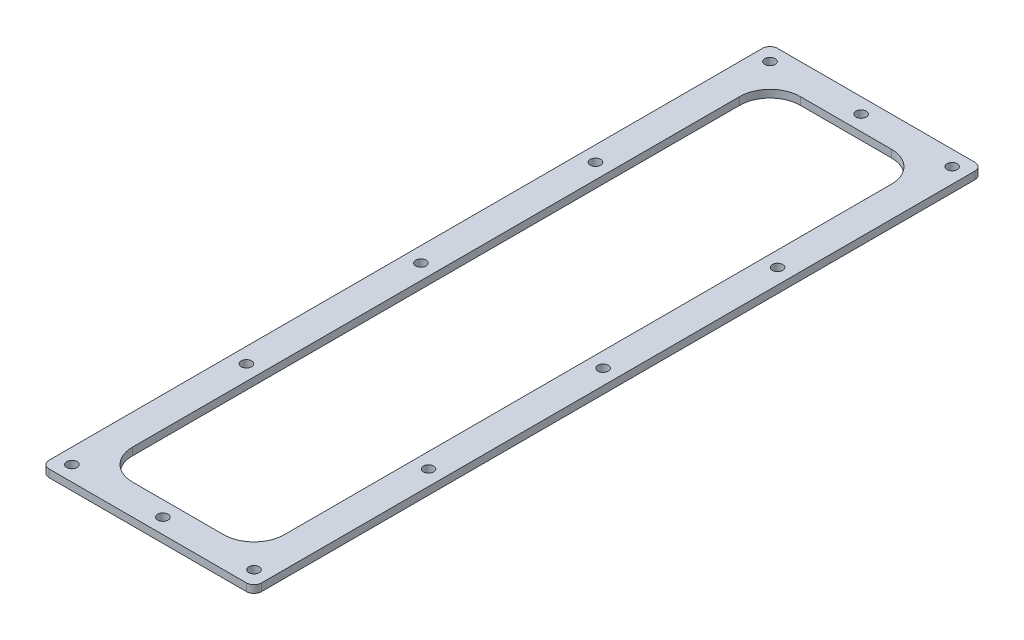
ISO-10303-21;
HEADER;
FILE_DESCRIPTION(('STEP AP214'),'2;1');
FILE_NAME('part.step','',(''),(''),'','','');
FILE_SCHEMA(('AUTOMOTIVE_DESIGN { 1 0 10303 214 1 1 1 1 }'));
ENDSEC;
DATA;
#1=APPLICATION_CONTEXT('core data for automotive mechanical design processes');
#2=APPLICATION_PROTOCOL_DEFINITION('international standard','automotive_design',2000,#1);
#3=PRODUCT_CONTEXT('',#1,'mechanical');
#4=PRODUCT('Part','Part','',(#3));
#5=PRODUCT_RELATED_PRODUCT_CATEGORY('part','',(#4));
#6=PRODUCT_DEFINITION_FORMATION('','',#4);
#7=PRODUCT_DEFINITION_CONTEXT('part definition',#1,'design');
#8=PRODUCT_DEFINITION('design','',#6,#7);
#9=PRODUCT_DEFINITION_SHAPE('','',#8);
#10=(LENGTH_UNIT() NAMED_UNIT(*) SI_UNIT(.MILLI.,.METRE.));
#11=(NAMED_UNIT(*) PLANE_ANGLE_UNIT() SI_UNIT($,.RADIAN.));
#12=(NAMED_UNIT(*) SI_UNIT($,.STERADIAN.) SOLID_ANGLE_UNIT());
#13=UNCERTAINTY_MEASURE_WITH_UNIT(LENGTH_MEASURE(1.E-05),#10,'distance_accuracy_value','');
#14=(GEOMETRIC_REPRESENTATION_CONTEXT(3) GLOBAL_UNCERTAINTY_ASSIGNED_CONTEXT((#13)) GLOBAL_UNIT_ASSIGNED_CONTEXT((#10,
#11,#12)) REPRESENTATION_CONTEXT('',''));
#15=CARTESIAN_POINT('',(0.,0.,0.));
#16=DIRECTION('',(0.,0.,1.));
#17=DIRECTION('',(1.,0.,0.));
#18=AXIS2_PLACEMENT_3D('',#15,#16,#17);
#19=CARTESIAN_POINT('',(0.,3.175,0.));
#20=DIRECTION('',(0.,1.,0.));
#21=DIRECTION('',(0.,0.,1.));
#22=AXIS2_PLACEMENT_3D('',#19,#20,#21);
#23=PLANE('',#22);
#24=CARTESIAN_POINT('',(-38.1,3.175,-73.025));
#25=DIRECTION('',(0.,1.,0.));
#26=DIRECTION('',(0.,0.,1.));
#27=AXIS2_PLACEMENT_3D('',#24,#25,#26);
#28=CIRCLE('',#27,2.15899999999999);
#29=CARTESIAN_POINT('',(-38.1,3.175,-70.866));
#30=VERTEX_POINT('',#29);
#31=EDGE_CURVE('E330',#30,#30,#28,.T.);
#32=ORIENTED_EDGE('',*,*,#31,.F.);
#33=EDGE_LOOP('',(#32));
#34=FACE_BOUND('',#33,.T.);
#35=CARTESIAN_POINT('',(-38.1,3.175,0.));
#36=DIRECTION('',(0.,1.,0.));
#37=DIRECTION('',(0.,0.,1.));
#38=AXIS2_PLACEMENT_3D('',#35,#36,#37);
#39=CIRCLE('',#38,2.15899999999999);
#40=CARTESIAN_POINT('',(-38.1,3.175,2.15899999999996));
#41=VERTEX_POINT('',#40);
#42=EDGE_CURVE('E324',#41,#41,#39,.T.);
#43=ORIENTED_EDGE('',*,*,#42,.F.);
#44=EDGE_LOOP('',(#43));
#45=FACE_BOUND('',#44,.T.);
#46=CARTESIAN_POINT('',(-38.1,3.175,73.025));
#47=DIRECTION('',(0.,1.,0.));
#48=DIRECTION('',(0.,0.,1.));
#49=AXIS2_PLACEMENT_3D('',#46,#47,#48);
#50=CIRCLE('',#49,2.15899999999999);
#51=CARTESIAN_POINT('',(-38.1,3.175,75.184));
#52=VERTEX_POINT('',#51);
#53=EDGE_CURVE('E318',#52,#52,#50,.T.);
#54=ORIENTED_EDGE('',*,*,#53,.F.);
#55=EDGE_LOOP('',(#54));
#56=FACE_BOUND('',#55,.T.);
#57=CARTESIAN_POINT('',(-38.1,3.175,146.05));
#58=DIRECTION('',(0.,1.,0.));
#59=DIRECTION('',(0.,0.,1.));
#60=AXIS2_PLACEMENT_3D('',#57,#58,#59);
#61=CIRCLE('',#60,2.15899999999998);
#62=CARTESIAN_POINT('',(-38.1,3.175,148.209));
#63=VERTEX_POINT('',#62);
#64=EDGE_CURVE('E312',#63,#63,#61,.T.);
#65=ORIENTED_EDGE('',*,*,#64,.F.);
#66=EDGE_LOOP('',(#65));
#67=FACE_BOUND('',#66,.T.);
#68=CARTESIAN_POINT('',(38.1,3.175,146.05));
#69=DIRECTION('',(0.,1.,0.));
#70=DIRECTION('',(0.,0.,-1.));
#71=AXIS2_PLACEMENT_3D('',#68,#69,#70);
#72=CIRCLE('',#71,2.15899999999998);
#73=CARTESIAN_POINT('',(38.1,3.175,143.891));
#74=VERTEX_POINT('',#73);
#75=EDGE_CURVE('E306',#74,#74,#72,.T.);
#76=ORIENTED_EDGE('',*,*,#75,.F.);
#77=EDGE_LOOP('',(#76));
#78=FACE_BOUND('',#77,.T.);
#79=CARTESIAN_POINT('',(38.1,3.175,73.025));
#80=DIRECTION('',(0.,1.,0.));
#81=DIRECTION('',(0.,0.,-1.));
#82=AXIS2_PLACEMENT_3D('',#79,#80,#81);
#83=CIRCLE('',#82,2.15899999999999);
#84=CARTESIAN_POINT('',(38.1,3.175,70.866));
#85=VERTEX_POINT('',#84);
#86=EDGE_CURVE('E300',#85,#85,#83,.T.);
#87=ORIENTED_EDGE('',*,*,#86,.F.);
#88=EDGE_LOOP('',(#87));
#89=FACE_BOUND('',#88,.T.);
#90=CARTESIAN_POINT('',(38.1,3.175,0.));
#91=DIRECTION('',(0.,1.,0.));
#92=DIRECTION('',(0.,0.,-1.));
#93=AXIS2_PLACEMENT_3D('',#90,#91,#92);
#94=CIRCLE('',#93,2.15899999999999);
#95=CARTESIAN_POINT('',(38.1,3.175,-2.15900000000001));
#96=VERTEX_POINT('',#95);
#97=EDGE_CURVE('E294',#96,#96,#94,.T.);
#98=ORIENTED_EDGE('',*,*,#97,.F.);
#99=EDGE_LOOP('',(#98));
#100=FACE_BOUND('',#99,.T.);
#101=CARTESIAN_POINT('',(38.1,3.175,-73.025));
#102=DIRECTION('',(0.,1.,0.));
#103=DIRECTION('',(0.,0.,-1.));
#104=AXIS2_PLACEMENT_3D('',#101,#102,#103);
#105=CIRCLE('',#104,2.15899999999999);
#106=CARTESIAN_POINT('',(38.1,3.175,-75.184));
#107=VERTEX_POINT('',#106);
#108=EDGE_CURVE('E287',#107,#107,#105,.T.);
#109=ORIENTED_EDGE('',*,*,#108,.F.);
#110=EDGE_LOOP('',(#109));
#111=FACE_BOUND('',#110,.T.);
#112=CARTESIAN_POINT('',(38.1,3.175,-146.05));
#113=DIRECTION('',(0.,1.,0.));
#114=DIRECTION('',(0.,0.,-1.));
#115=AXIS2_PLACEMENT_3D('',#112,#113,#114);
#116=CIRCLE('',#115,2.15899999999998);
#117=CARTESIAN_POINT('',(38.1,3.175,-148.209));
#118=VERTEX_POINT('',#117);
#119=EDGE_CURVE('E347',#118,#118,#116,.T.);
#120=ORIENTED_EDGE('',*,*,#119,.F.);
#121=EDGE_LOOP('',(#120));
#122=FACE_BOUND('',#121,.T.);
#123=CARTESIAN_POINT('',(0.,3.175,-146.05));
#124=DIRECTION('',(0.,1.,0.));
#125=DIRECTION('',(0.,0.,1.));
#126=AXIS2_PLACEMENT_3D('',#123,#124,#125);
#127=CIRCLE('',#126,2.15899999999998);
#128=CARTESIAN_POINT('',(0.,3.175,-143.891));
#129=VERTEX_POINT('',#128);
#130=EDGE_CURVE('E341',#129,#129,#127,.T.);
#131=ORIENTED_EDGE('',*,*,#130,.F.);
#132=EDGE_LOOP('',(#131));
#133=FACE_BOUND('',#132,.T.);
#134=CARTESIAN_POINT('',(0.,3.175,146.05));
#135=DIRECTION('',(0.,1.,0.));
#136=DIRECTION('',(0.,0.,-1.));
#137=AXIS2_PLACEMENT_3D('',#134,#135,#136);
#138=CIRCLE('',#137,2.15899999999998);
#139=CARTESIAN_POINT('',(0.,3.175,143.891));
#140=VERTEX_POINT('',#139);
#141=EDGE_CURVE('E335',#140,#140,#138,.T.);
#142=ORIENTED_EDGE('',*,*,#141,.F.);
#143=EDGE_LOOP('',(#142));
#144=FACE_BOUND('',#143,.T.);
#145=CARTESIAN_POINT('',(-38.1,3.175,-146.05));
#146=DIRECTION('',(0.,1.,0.));
#147=DIRECTION('',(0.,0.,1.));
#148=AXIS2_PLACEMENT_3D('',#145,#146,#147);
#149=CIRCLE('',#148,2.15899999999998);
#150=CARTESIAN_POINT('',(-38.1,3.175,-143.891));
#151=VERTEX_POINT('',#150);
#152=EDGE_CURVE('E281',#151,#151,#149,.T.);
#153=ORIENTED_EDGE('',*,*,#152,.F.);
#154=EDGE_LOOP('',(#153));
#155=FACE_BOUND('',#154,.T.);
#156=DIRECTION('',(0.,0.,1.));
#157=VECTOR('',#156,1.);
#158=CARTESIAN_POINT('',(-44.45,3.175,-152.4));
#159=LINE('',#158,#157);
#160=CARTESIAN_POINT('',(-44.45,3.175,-149.225));
#161=VERTEX_POINT('',#160);
#162=CARTESIAN_POINT('',(-44.45,3.175,149.225));
#163=VERTEX_POINT('',#162);
#164=EDGE_CURVE('E252',#161,#163,#159,.T.);
#165=ORIENTED_EDGE('',*,*,#164,.T.);
#166=CARTESIAN_POINT('',(-41.275,3.175,149.225));
#167=DIRECTION('',(0.,1.,0.));
#168=DIRECTION('',(0.,0.,1.));
#169=AXIS2_PLACEMENT_3D('',#166,#167,#168);
#170=CIRCLE('',#169,3.175);
#171=CARTESIAN_POINT('',(-41.275,3.175,152.4));
#172=VERTEX_POINT('',#171);
#173=EDGE_CURVE('E231',#163,#172,#170,.T.);
#174=ORIENTED_EDGE('',*,*,#173,.T.);
#175=DIRECTION('',(1.,0.,0.));
#176=VECTOR('',#175,1.);
#177=CARTESIAN_POINT('',(-44.45,3.175,152.4));
#178=LINE('',#177,#176);
#179=CARTESIAN_POINT('',(41.275,3.175,152.4));
#180=VERTEX_POINT('',#179);
#181=EDGE_CURVE('E260',#172,#180,#178,.T.);
#182=ORIENTED_EDGE('',*,*,#181,.T.);
#183=CARTESIAN_POINT('',(41.275,3.175,149.225));
#184=DIRECTION('',(0.,1.,0.));
#185=DIRECTION('',(0.,0.,1.));
#186=AXIS2_PLACEMENT_3D('',#183,#184,#185);
#187=CIRCLE('',#186,3.175);
#188=CARTESIAN_POINT('',(44.45,3.175,149.225));
#189=VERTEX_POINT('',#188);
#190=EDGE_CURVE('E229',#180,#189,#187,.T.);
#191=ORIENTED_EDGE('',*,*,#190,.T.);
#192=DIRECTION('',(0.,0.,-1.));
#193=VECTOR('',#192,1.);
#194=CARTESIAN_POINT('',(44.45,3.175,-152.4));
#195=LINE('',#194,#193);
#196=CARTESIAN_POINT('',(44.45,3.175,-149.225));
#197=VERTEX_POINT('',#196);
#198=EDGE_CURVE('E177',#189,#197,#195,.T.);
#199=ORIENTED_EDGE('',*,*,#198,.T.);
#200=CARTESIAN_POINT('',(41.275,3.175,-149.225));
#201=DIRECTION('',(0.,1.,0.));
#202=DIRECTION('',(0.,0.,1.));
#203=AXIS2_PLACEMENT_3D('',#200,#201,#202);
#204=CIRCLE('',#203,3.175);
#205=CARTESIAN_POINT('',(41.275,3.175,-152.4));
#206=VERTEX_POINT('',#205);
#207=EDGE_CURVE('E54',#197,#206,#204,.T.);
#208=ORIENTED_EDGE('',*,*,#207,.T.);
#209=DIRECTION('',(-1.,0.,0.));
#210=VECTOR('',#209,1.);
#211=CARTESIAN_POINT('',(-44.45,3.175,-152.4));
#212=LINE('',#211,#210);
#213=CARTESIAN_POINT('',(-41.275,3.175,-152.4));
#214=VERTEX_POINT('',#213);
#215=EDGE_CURVE('E173',#206,#214,#212,.T.);
#216=ORIENTED_EDGE('',*,*,#215,.T.);
#217=CARTESIAN_POINT('',(-41.275,3.175,-149.225));
#218=DIRECTION('',(0.,1.,0.));
#219=DIRECTION('',(0.,0.,1.));
#220=AXIS2_PLACEMENT_3D('',#217,#218,#219);
#221=CIRCLE('',#220,3.175);
#222=EDGE_CURVE('E226',#214,#161,#221,.T.);
#223=ORIENTED_EDGE('',*,*,#222,.T.);
#224=EDGE_LOOP('',(#165,#174,#182,#191,#199,#208,#216,#223));
#225=FACE_BOUND('',#224,.T.);
#226=DIRECTION('',(1.,0.,0.));
#227=VECTOR('',#226,1.);
#228=CARTESIAN_POINT('',(-31.75,3.175,139.7));
#229=LINE('',#228,#227);
#230=CARTESIAN_POINT('',(-19.05,3.175,139.7));
#231=VERTEX_POINT('',#230);
#232=CARTESIAN_POINT('',(19.0500000000001,3.175,139.7));
#233=VERTEX_POINT('',#232);
#234=EDGE_CURVE('E277',#231,#233,#229,.T.);
#235=ORIENTED_EDGE('',*,*,#234,.F.);
#236=CARTESIAN_POINT('',(-19.05,3.175,127.));
#237=DIRECTION('',(0.,1.,0.));
#238=DIRECTION('',(0.,0.,1.));
#239=AXIS2_PLACEMENT_3D('',#236,#237,#238);
#240=CIRCLE('',#239,12.7);
#241=CARTESIAN_POINT('',(-31.75,3.175,127.));
#242=VERTEX_POINT('',#241);
#243=EDGE_CURVE('E158',#231,#242,#240,.F.);
#244=ORIENTED_EDGE('',*,*,#243,.T.);
#245=DIRECTION('',(0.,0.,1.));
#246=VECTOR('',#245,1.);
#247=CARTESIAN_POINT('',(-31.75,3.175,-139.7));
#248=LINE('',#247,#246);
#249=CARTESIAN_POINT('',(-31.75,3.175,-127.));
#250=VERTEX_POINT('',#249);
#251=EDGE_CURVE('E267',#250,#242,#248,.T.);
#252=ORIENTED_EDGE('',*,*,#251,.F.);
#253=CARTESIAN_POINT('',(-19.05,3.175,-127.));
#254=DIRECTION('',(0.,1.,0.));
#255=DIRECTION('',(0.,0.,1.));
#256=AXIS2_PLACEMENT_3D('',#253,#254,#255);
#257=CIRCLE('',#256,12.7);
#258=CARTESIAN_POINT('',(-19.05,3.175,-139.7));
#259=VERTEX_POINT('',#258);
#260=EDGE_CURVE('E202',#250,#259,#257,.F.);
#261=ORIENTED_EDGE('',*,*,#260,.T.);
#262=DIRECTION('',(-1.,0.,0.));
#263=VECTOR('',#262,1.);
#264=CARTESIAN_POINT('',(-31.75,3.175,-139.7));
#265=LINE('',#264,#263);
#266=CARTESIAN_POINT('',(19.05,3.175,-139.7));
#267=VERTEX_POINT('',#266);
#268=EDGE_CURVE('E257',#267,#259,#265,.T.);
#269=ORIENTED_EDGE('',*,*,#268,.F.);
#270=CARTESIAN_POINT('',(19.0500000000001,3.175,-127.));
#271=DIRECTION('',(0.,1.,0.));
#272=DIRECTION('',(0.,0.,1.));
#273=AXIS2_PLACEMENT_3D('',#270,#271,#272);
#274=CIRCLE('',#273,12.7);
#275=CARTESIAN_POINT('',(31.7500000000001,3.175,-127.));
#276=VERTEX_POINT('',#275);
#277=EDGE_CURVE('E206',#267,#276,#274,.F.);
#278=ORIENTED_EDGE('',*,*,#277,.T.);
#279=DIRECTION('',(0.,0.,-1.));
#280=VECTOR('',#279,1.);
#281=CARTESIAN_POINT('',(31.7500000000001,3.175,-139.7));
#282=LINE('',#281,#280);
#283=CARTESIAN_POINT('',(31.7500000000001,3.175,127.));
#284=VERTEX_POINT('',#283);
#285=EDGE_CURVE('E274',#284,#276,#282,.T.);
#286=ORIENTED_EDGE('',*,*,#285,.F.);
#287=CARTESIAN_POINT('',(19.0500000000001,3.175,127.));
#288=DIRECTION('',(0.,1.,0.));
#289=DIRECTION('',(0.,0.,1.));
#290=AXIS2_PLACEMENT_3D('',#287,#288,#289);
#291=CIRCLE('',#290,12.7);
#292=EDGE_CURVE('E159',#284,#233,#291,.F.);
#293=ORIENTED_EDGE('',*,*,#292,.T.);
#294=EDGE_LOOP('',(#235,#244,#252,#261,#269,#278,#286,#293));
#295=FACE_BOUND('',#294,.T.);
#296=ADVANCED_FACE('F33',(#34,#45,#56,#67,#78,#89,#100,#111,#122,#133,#144,#155,#225,#295),#23,.T.);
#297=CARTESIAN_POINT('',(0.,0.,0.));
#298=DIRECTION('',(0.,1.,0.));
#299=DIRECTION('',(0.,0.,1.));
#300=AXIS2_PLACEMENT_3D('',#297,#298,#299);
#301=PLANE('',#300);
#302=CARTESIAN_POINT('',(-38.1,0.,-73.025));
#303=DIRECTION('',(0.,1.,0.));
#304=DIRECTION('',(0.,0.,1.));
#305=AXIS2_PLACEMENT_3D('',#302,#303,#304);
#306=CIRCLE('',#305,2.15899999999999);
#307=CARTESIAN_POINT('',(-38.1,0.,-70.866));
#308=VERTEX_POINT('',#307);
#309=EDGE_CURVE('E284',#308,#308,#306,.T.);
#310=ORIENTED_EDGE('',*,*,#309,.T.);
#311=EDGE_LOOP('',(#310));
#312=FACE_BOUND('',#311,.T.);
#313=CARTESIAN_POINT('',(-38.1,0.,0.));
#314=DIRECTION('',(0.,1.,0.));
#315=DIRECTION('',(0.,0.,1.));
#316=AXIS2_PLACEMENT_3D('',#313,#314,#315);
#317=CIRCLE('',#316,2.15899999999999);
#318=CARTESIAN_POINT('',(-38.1,0.,2.15899999999996));
#319=VERTEX_POINT('',#318);
#320=EDGE_CURVE('E327',#319,#319,#317,.T.);
#321=ORIENTED_EDGE('',*,*,#320,.T.);
#322=EDGE_LOOP('',(#321));
#323=FACE_BOUND('',#322,.T.);
#324=CARTESIAN_POINT('',(-38.1,0.,73.025));
#325=DIRECTION('',(0.,1.,0.));
#326=DIRECTION('',(0.,0.,1.));
#327=AXIS2_PLACEMENT_3D('',#324,#325,#326);
#328=CIRCLE('',#327,2.15899999999999);
#329=CARTESIAN_POINT('',(-38.1,0.,75.184));
#330=VERTEX_POINT('',#329);
#331=EDGE_CURVE('E321',#330,#330,#328,.T.);
#332=ORIENTED_EDGE('',*,*,#331,.T.);
#333=EDGE_LOOP('',(#332));
#334=FACE_BOUND('',#333,.T.);
#335=CARTESIAN_POINT('',(-38.1,0.,146.05));
#336=DIRECTION('',(0.,1.,0.));
#337=DIRECTION('',(0.,0.,1.));
#338=AXIS2_PLACEMENT_3D('',#335,#336,#337);
#339=CIRCLE('',#338,2.15899999999998);
#340=CARTESIAN_POINT('',(-38.1,0.,148.209));
#341=VERTEX_POINT('',#340);
#342=EDGE_CURVE('E315',#341,#341,#339,.T.);
#343=ORIENTED_EDGE('',*,*,#342,.T.);
#344=EDGE_LOOP('',(#343));
#345=FACE_BOUND('',#344,.T.);
#346=CARTESIAN_POINT('',(38.1,0.,146.05));
#347=DIRECTION('',(0.,1.,0.));
#348=DIRECTION('',(0.,0.,-1.));
#349=AXIS2_PLACEMENT_3D('',#346,#347,#348);
#350=CIRCLE('',#349,2.15899999999998);
#351=CARTESIAN_POINT('',(38.1,0.,143.891));
#352=VERTEX_POINT('',#351);
#353=EDGE_CURVE('E309',#352,#352,#350,.T.);
#354=ORIENTED_EDGE('',*,*,#353,.T.);
#355=EDGE_LOOP('',(#354));
#356=FACE_BOUND('',#355,.T.);
#357=CARTESIAN_POINT('',(38.1,0.,73.025));
#358=DIRECTION('',(0.,1.,0.));
#359=DIRECTION('',(0.,0.,-1.));
#360=AXIS2_PLACEMENT_3D('',#357,#358,#359);
#361=CIRCLE('',#360,2.15899999999999);
#362=CARTESIAN_POINT('',(38.1,0.,70.866));
#363=VERTEX_POINT('',#362);
#364=EDGE_CURVE('E303',#363,#363,#361,.T.);
#365=ORIENTED_EDGE('',*,*,#364,.T.);
#366=EDGE_LOOP('',(#365));
#367=FACE_BOUND('',#366,.T.);
#368=CARTESIAN_POINT('',(38.1,0.,0.));
#369=DIRECTION('',(0.,1.,0.));
#370=DIRECTION('',(0.,0.,-1.));
#371=AXIS2_PLACEMENT_3D('',#368,#369,#370);
#372=CIRCLE('',#371,2.15899999999999);
#373=CARTESIAN_POINT('',(38.1,0.,-2.15900000000001));
#374=VERTEX_POINT('',#373);
#375=EDGE_CURVE('E297',#374,#374,#372,.T.);
#376=ORIENTED_EDGE('',*,*,#375,.T.);
#377=EDGE_LOOP('',(#376));
#378=FACE_BOUND('',#377,.T.);
#379=CARTESIAN_POINT('',(38.1,0.,-73.025));
#380=DIRECTION('',(0.,1.,0.));
#381=DIRECTION('',(0.,0.,-1.));
#382=AXIS2_PLACEMENT_3D('',#379,#380,#381);
#383=CIRCLE('',#382,2.15899999999999);
#384=CARTESIAN_POINT('',(38.1,0.,-75.184));
#385=VERTEX_POINT('',#384);
#386=EDGE_CURVE('E290',#385,#385,#383,.T.);
#387=ORIENTED_EDGE('',*,*,#386,.T.);
#388=EDGE_LOOP('',(#387));
#389=FACE_BOUND('',#388,.T.);
#390=CARTESIAN_POINT('',(38.1,0.,-146.05));
#391=DIRECTION('',(0.,1.,0.));
#392=DIRECTION('',(0.,0.,-1.));
#393=AXIS2_PLACEMENT_3D('',#390,#391,#392);
#394=CIRCLE('',#393,2.15899999999998);
#395=CARTESIAN_POINT('',(38.1,0.,-148.209));
#396=VERTEX_POINT('',#395);
#397=EDGE_CURVE('E291',#396,#396,#394,.T.);
#398=ORIENTED_EDGE('',*,*,#397,.T.);
#399=EDGE_LOOP('',(#398));
#400=FACE_BOUND('',#399,.T.);
#401=CARTESIAN_POINT('',(0.,0.,-146.05));
#402=DIRECTION('',(0.,1.,0.));
#403=DIRECTION('',(0.,0.,1.));
#404=AXIS2_PLACEMENT_3D('',#401,#402,#403);
#405=CIRCLE('',#404,2.15899999999998);
#406=CARTESIAN_POINT('',(0.,0.,-143.891));
#407=VERTEX_POINT('',#406);
#408=EDGE_CURVE('E344',#407,#407,#405,.T.);
#409=ORIENTED_EDGE('',*,*,#408,.T.);
#410=EDGE_LOOP('',(#409));
#411=FACE_BOUND('',#410,.T.);
#412=CARTESIAN_POINT('',(0.,0.,146.05));
#413=DIRECTION('',(0.,1.,0.));
#414=DIRECTION('',(0.,0.,-1.));
#415=AXIS2_PLACEMENT_3D('',#412,#413,#414);
#416=CIRCLE('',#415,2.15899999999998);
#417=CARTESIAN_POINT('',(0.,0.,143.891));
#418=VERTEX_POINT('',#417);
#419=EDGE_CURVE('E338',#418,#418,#416,.T.);
#420=ORIENTED_EDGE('',*,*,#419,.T.);
#421=EDGE_LOOP('',(#420));
#422=FACE_BOUND('',#421,.T.);
#423=CARTESIAN_POINT('',(-38.1,0.,-146.05));
#424=DIRECTION('',(0.,1.,0.));
#425=DIRECTION('',(0.,0.,1.));
#426=AXIS2_PLACEMENT_3D('',#423,#424,#425);
#427=CIRCLE('',#426,2.15899999999998);
#428=CARTESIAN_POINT('',(-38.1,0.,-143.891));
#429=VERTEX_POINT('',#428);
#430=EDGE_CURVE('E271',#429,#429,#427,.T.);
#431=ORIENTED_EDGE('',*,*,#430,.T.);
#432=EDGE_LOOP('',(#431));
#433=FACE_BOUND('',#432,.T.);
#434=DIRECTION('',(1.,0.,0.));
#435=VECTOR('',#434,1.);
#436=CARTESIAN_POINT('',(-44.45,0.,152.4));
#437=LINE('',#436,#435);
#438=CARTESIAN_POINT('',(-41.275,0.,152.4));
#439=VERTEX_POINT('',#438);
#440=CARTESIAN_POINT('',(41.275,0.,152.4));
#441=VERTEX_POINT('',#440);
#442=EDGE_CURVE('E251',#439,#441,#437,.T.);
#443=ORIENTED_EDGE('',*,*,#442,.F.);
#444=CARTESIAN_POINT('',(-41.275,0.,149.225));
#445=DIRECTION('',(0.,1.,0.));
#446=DIRECTION('',(0.,0.,1.));
#447=AXIS2_PLACEMENT_3D('',#444,#445,#446);
#448=CIRCLE('',#447,3.175);
#449=CARTESIAN_POINT('',(-44.45,0.,149.225));
#450=VERTEX_POINT('',#449);
#451=EDGE_CURVE('E219',#439,#450,#448,.F.);
#452=ORIENTED_EDGE('',*,*,#451,.T.);
#453=DIRECTION('',(0.,0.,1.));
#454=VECTOR('',#453,1.);
#455=CARTESIAN_POINT('',(-44.45,0.,-152.4));
#456=LINE('',#455,#454);
#457=CARTESIAN_POINT('',(-44.45,0.,-149.225));
#458=VERTEX_POINT('',#457);
#459=EDGE_CURVE('E253',#458,#450,#456,.T.);
#460=ORIENTED_EDGE('',*,*,#459,.F.);
#461=CARTESIAN_POINT('',(-41.275,0.,-149.225));
#462=DIRECTION('',(0.,1.,0.));
#463=DIRECTION('',(0.,0.,1.));
#464=AXIS2_PLACEMENT_3D('',#461,#462,#463);
#465=CIRCLE('',#464,3.175);
#466=CARTESIAN_POINT('',(-41.275,0.,-152.4));
#467=VERTEX_POINT('',#466);
#468=EDGE_CURVE('E213',#458,#467,#465,.F.);
#469=ORIENTED_EDGE('',*,*,#468,.T.);
#470=DIRECTION('',(-1.,0.,0.));
#471=VECTOR('',#470,1.);
#472=CARTESIAN_POINT('',(-44.45,0.,-152.4));
#473=LINE('',#472,#471);
#474=CARTESIAN_POINT('',(41.275,0.,-152.4));
#475=VERTEX_POINT('',#474);
#476=EDGE_CURVE('E180',#475,#467,#473,.T.);
#477=ORIENTED_EDGE('',*,*,#476,.F.);
#478=CARTESIAN_POINT('',(41.275,0.,-149.225));
#479=DIRECTION('',(0.,1.,0.));
#480=DIRECTION('',(0.,0.,1.));
#481=AXIS2_PLACEMENT_3D('',#478,#479,#480);
#482=CIRCLE('',#481,3.175);
#483=CARTESIAN_POINT('',(44.45,0.,-149.225));
#484=VERTEX_POINT('',#483);
#485=EDGE_CURVE('E215',#475,#484,#482,.F.);
#486=ORIENTED_EDGE('',*,*,#485,.T.);
#487=DIRECTION('',(0.,0.,-1.));
#488=VECTOR('',#487,1.);
#489=CARTESIAN_POINT('',(44.45,0.,-152.4));
#490=LINE('',#489,#488);
#491=CARTESIAN_POINT('',(44.45,0.,149.225));
#492=VERTEX_POINT('',#491);
#493=EDGE_CURVE('E243',#492,#484,#490,.T.);
#494=ORIENTED_EDGE('',*,*,#493,.F.);
#495=CARTESIAN_POINT('',(41.275,0.,149.225));
#496=DIRECTION('',(0.,1.,0.));
#497=DIRECTION('',(0.,0.,1.));
#498=AXIS2_PLACEMENT_3D('',#495,#496,#497);
#499=CIRCLE('',#498,3.175);
#500=EDGE_CURVE('E217',#492,#441,#499,.F.);
#501=ORIENTED_EDGE('',*,*,#500,.T.);
#502=EDGE_LOOP('',(#443,#452,#460,#469,#477,#486,#494,#501));
#503=FACE_BOUND('',#502,.T.);
#504=DIRECTION('',(-1.,0.,0.));
#505=VECTOR('',#504,1.);
#506=CARTESIAN_POINT('',(-31.75,0.,-139.7));
#507=LINE('',#506,#505);
#508=CARTESIAN_POINT('',(19.05,0.,-139.7));
#509=VERTEX_POINT('',#508);
#510=CARTESIAN_POINT('',(-19.05,0.,-139.7));
#511=VERTEX_POINT('',#510);
#512=EDGE_CURVE('E265',#509,#511,#507,.T.);
#513=ORIENTED_EDGE('',*,*,#512,.T.);
#514=CARTESIAN_POINT('',(-19.05,0.,-127.));
#515=DIRECTION('',(0.,1.,0.));
#516=DIRECTION('',(0.,0.,1.));
#517=AXIS2_PLACEMENT_3D('',#514,#515,#516);
#518=CIRCLE('',#517,12.7);
#519=CARTESIAN_POINT('',(-31.75,0.,-127.));
#520=VERTEX_POINT('',#519);
#521=EDGE_CURVE('E200',#511,#520,#518,.T.);
#522=ORIENTED_EDGE('',*,*,#521,.T.);
#523=DIRECTION('',(0.,0.,1.));
#524=VECTOR('',#523,1.);
#525=CARTESIAN_POINT('',(-31.75,0.,-139.7));
#526=LINE('',#525,#524);
#527=CARTESIAN_POINT('',(-31.75,0.,127.));
#528=VERTEX_POINT('',#527);
#529=EDGE_CURVE('E153',#520,#528,#526,.T.);
#530=ORIENTED_EDGE('',*,*,#529,.T.);
#531=CARTESIAN_POINT('',(-19.05,0.,127.));
#532=DIRECTION('',(0.,1.,0.));
#533=DIRECTION('',(0.,0.,1.));
#534=AXIS2_PLACEMENT_3D('',#531,#532,#533);
#535=CIRCLE('',#534,12.7);
#536=CARTESIAN_POINT('',(-19.05,0.,139.7));
#537=VERTEX_POINT('',#536);
#538=EDGE_CURVE('E147',#528,#537,#535,.T.);
#539=ORIENTED_EDGE('',*,*,#538,.T.);
#540=DIRECTION('',(1.,0.,0.));
#541=VECTOR('',#540,1.);
#542=CARTESIAN_POINT('',(-31.75,0.,139.7));
#543=LINE('',#542,#541);
#544=CARTESIAN_POINT('',(19.0500000000001,0.,139.7));
#545=VERTEX_POINT('',#544);
#546=EDGE_CURVE('E151',#537,#545,#543,.T.);
#547=ORIENTED_EDGE('',*,*,#546,.T.);
#548=CARTESIAN_POINT('',(19.0500000000001,0.,127.));
#549=DIRECTION('',(0.,1.,0.));
#550=DIRECTION('',(0.,0.,1.));
#551=AXIS2_PLACEMENT_3D('',#548,#549,#550);
#552=CIRCLE('',#551,12.7);
#553=CARTESIAN_POINT('',(31.7500000000001,0.,127.));
#554=VERTEX_POINT('',#553);
#555=EDGE_CURVE('E196',#545,#554,#552,.T.);
#556=ORIENTED_EDGE('',*,*,#555,.T.);
#557=DIRECTION('',(0.,0.,-1.));
#558=VECTOR('',#557,1.);
#559=CARTESIAN_POINT('',(31.7500000000001,0.,-139.7));
#560=LINE('',#559,#558);
#561=CARTESIAN_POINT('',(31.7500000000001,0.,-127.));
#562=VERTEX_POINT('',#561);
#563=EDGE_CURVE('E169',#554,#562,#560,.T.);
#564=ORIENTED_EDGE('',*,*,#563,.T.);
#565=CARTESIAN_POINT('',(19.0500000000001,0.,-127.));
#566=DIRECTION('',(0.,1.,0.));
#567=DIRECTION('',(0.,0.,1.));
#568=AXIS2_PLACEMENT_3D('',#565,#566,#567);
#569=CIRCLE('',#568,12.7);
#570=EDGE_CURVE('E204',#562,#509,#569,.T.);
#571=ORIENTED_EDGE('',*,*,#570,.T.);
#572=EDGE_LOOP('',(#513,#522,#530,#539,#547,#556,#564,#571));
#573=FACE_BOUND('',#572,.T.);
#574=ADVANCED_FACE('F150',(#312,#323,#334,#345,#356,#367,#378,#389,#400,#411,#422,#433,#503,
#573),#301,.F.);
#575=CARTESIAN_POINT('',(-44.45,3.175,-152.4));
#576=DIRECTION('',(1.,0.,0.));
#577=DIRECTION('',(0.,0.,-1.));
#578=AXIS2_PLACEMENT_3D('',#575,#576,#577);
#579=PLANE('',#578);
#580=ORIENTED_EDGE('',*,*,#459,.T.);
#581=DIRECTION('',(0.,-1.,0.));
#582=VECTOR('',#581,1.);
#583=CARTESIAN_POINT('',(-44.45,3.175,149.225));
#584=LINE('',#583,#582);
#585=EDGE_CURVE('E224',#450,#163,#584,.F.);
#586=ORIENTED_EDGE('',*,*,#585,.T.);
#587=ORIENTED_EDGE('',*,*,#164,.F.);
#588=DIRECTION('',(0.,-1.,0.));
#589=VECTOR('',#588,1.);
#590=CARTESIAN_POINT('',(-44.45,3.175,-149.225));
#591=LINE('',#590,#589);
#592=EDGE_CURVE('E221',#161,#458,#591,.T.);
#593=ORIENTED_EDGE('',*,*,#592,.T.);
#594=EDGE_LOOP('',(#580,#586,#587,#593));
#595=FACE_BOUND('',#594,.T.);
#596=ADVANCED_FACE('F412',(#595),#579,.F.);
#597=CARTESIAN_POINT('',(-44.45,3.175,152.4));
#598=DIRECTION('',(0.,0.,-1.));
#599=DIRECTION('',(-1.,0.,0.));
#600=AXIS2_PLACEMENT_3D('',#597,#598,#599);
#601=PLANE('',#600);
#602=ORIENTED_EDGE('',*,*,#181,.F.);
#603=DIRECTION('',(0.,-1.,0.));
#604=VECTOR('',#603,1.);
#605=CARTESIAN_POINT('',(-41.275,3.175,152.4));
#606=LINE('',#605,#604);
#607=EDGE_CURVE('E210',#172,#439,#606,.T.);
#608=ORIENTED_EDGE('',*,*,#607,.T.);
#609=ORIENTED_EDGE('',*,*,#442,.T.);
#610=DIRECTION('',(0.,-1.,0.));
#611=VECTOR('',#610,1.);
#612=CARTESIAN_POINT('',(41.275,3.175,152.4));
#613=LINE('',#612,#611);
#614=EDGE_CURVE('E208',#441,#180,#613,.F.);
#615=ORIENTED_EDGE('',*,*,#614,.T.);
#616=EDGE_LOOP('',(#602,#608,#609,#615));
#617=FACE_BOUND('',#616,.T.);
#618=ADVANCED_FACE('F417',(#617),#601,.F.);
#619=CARTESIAN_POINT('',(44.45,3.175,-152.4));
#620=DIRECTION('',(-1.,0.,0.));
#621=DIRECTION('',(0.,0.,1.));
#622=AXIS2_PLACEMENT_3D('',#619,#620,#621);
#623=PLANE('',#622);
#624=ORIENTED_EDGE('',*,*,#198,.F.);
#625=DIRECTION('',(0.,-1.,0.));
#626=VECTOR('',#625,1.);
#627=CARTESIAN_POINT('',(44.45,3.175,149.225));
#628=LINE('',#627,#626);
#629=EDGE_CURVE('E235',#189,#492,#628,.T.);
#630=ORIENTED_EDGE('',*,*,#629,.T.);
#631=ORIENTED_EDGE('',*,*,#493,.T.);
#632=DIRECTION('',(0.,-1.,0.));
#633=VECTOR('',#632,1.);
#634=CARTESIAN_POINT('',(44.45,3.175,-149.225));
#635=LINE('',#634,#633);
#636=EDGE_CURVE('E233',#484,#197,#635,.F.);
#637=ORIENTED_EDGE('',*,*,#636,.T.);
#638=EDGE_LOOP('',(#624,#630,#631,#637));
#639=FACE_BOUND('',#638,.T.);
#640=ADVANCED_FACE('F242',(#639),#623,.F.);
#641=CARTESIAN_POINT('',(-44.45,3.175,-152.4));
#642=DIRECTION('',(0.,0.,1.));
#643=DIRECTION('',(1.,0.,0.));
#644=AXIS2_PLACEMENT_3D('',#641,#642,#643);
#645=PLANE('',#644);
#646=ORIENTED_EDGE('',*,*,#215,.F.);
#647=DIRECTION('',(0.,-1.,0.));
#648=VECTOR('',#647,1.);
#649=CARTESIAN_POINT('',(41.275,3.175,-152.4));
#650=LINE('',#649,#648);
#651=EDGE_CURVE('E11',#206,#475,#650,.T.);
#652=ORIENTED_EDGE('',*,*,#651,.T.);
#653=ORIENTED_EDGE('',*,*,#476,.T.);
#654=DIRECTION('',(0.,-1.,0.));
#655=VECTOR('',#654,1.);
#656=CARTESIAN_POINT('',(-41.275,3.175,-152.4));
#657=LINE('',#656,#655);
#658=EDGE_CURVE('E41',#467,#214,#657,.F.);
#659=ORIENTED_EDGE('',*,*,#658,.T.);
#660=EDGE_LOOP('',(#646,#652,#653,#659));
#661=FACE_BOUND('',#660,.T.);
#662=ADVANCED_FACE('F401',(#661),#645,.F.);
#663=CARTESIAN_POINT('',(-31.75,3.175,-139.7));
#664=DIRECTION('',(1.,0.,0.));
#665=DIRECTION('',(0.,0.,-1.));
#666=AXIS2_PLACEMENT_3D('',#663,#664,#665);
#667=PLANE('',#666);
#668=ORIENTED_EDGE('',*,*,#251,.T.);
#669=DIRECTION('',(0.,-1.,0.));
#670=VECTOR('',#669,1.);
#671=CARTESIAN_POINT('',(-31.75,0.,127.));
#672=LINE('',#671,#670);
#673=EDGE_CURVE('E189',#242,#528,#672,.T.);
#674=ORIENTED_EDGE('',*,*,#673,.T.);
#675=ORIENTED_EDGE('',*,*,#529,.F.);
#676=DIRECTION('',(0.,-1.,0.));
#677=VECTOR('',#676,1.);
#678=CARTESIAN_POINT('',(-31.75,3.175,-127.));
#679=LINE('',#678,#677);
#680=EDGE_CURVE('E187',#520,#250,#679,.F.);
#681=ORIENTED_EDGE('',*,*,#680,.T.);
#682=EDGE_LOOP('',(#668,#674,#675,#681));
#683=FACE_BOUND('',#682,.T.);
#684=ADVANCED_FACE('F399',(#683),#667,.T.);
#685=CARTESIAN_POINT('',(-31.75,3.175,139.7));
#686=DIRECTION('',(0.,0.,-1.));
#687=DIRECTION('',(-1.,0.,0.));
#688=AXIS2_PLACEMENT_3D('',#685,#686,#687);
#689=PLANE('',#688);
#690=ORIENTED_EDGE('',*,*,#234,.T.);
#691=DIRECTION('',(0.,-1.,0.));
#692=VECTOR('',#691,1.);
#693=CARTESIAN_POINT('',(19.0500000000001,0.,139.7));
#694=LINE('',#693,#692);
#695=EDGE_CURVE('E168',#233,#545,#694,.T.);
#696=ORIENTED_EDGE('',*,*,#695,.T.);
#697=ORIENTED_EDGE('',*,*,#546,.F.);
#698=DIRECTION('',(0.,-1.,0.));
#699=VECTOR('',#698,1.);
#700=CARTESIAN_POINT('',(-19.05,3.175,139.7));
#701=LINE('',#700,#699);
#702=EDGE_CURVE('E165',#537,#231,#701,.F.);
#703=ORIENTED_EDGE('',*,*,#702,.T.);
#704=EDGE_LOOP('',(#690,#696,#697,#703));
#705=FACE_BOUND('',#704,.T.);
#706=ADVANCED_FACE('F164',(#705),#689,.T.);
#707=CARTESIAN_POINT('',(31.7500000000001,3.175,-139.7));
#708=DIRECTION('',(-1.,0.,0.));
#709=DIRECTION('',(0.,0.,1.));
#710=AXIS2_PLACEMENT_3D('',#707,#708,#709);
#711=PLANE('',#710);
#712=ORIENTED_EDGE('',*,*,#563,.F.);
#713=DIRECTION('',(0.,-1.,0.));
#714=VECTOR('',#713,1.);
#715=CARTESIAN_POINT('',(31.7500000000001,3.175,127.));
#716=LINE('',#715,#714);
#717=EDGE_CURVE('E185',#554,#284,#716,.F.);
#718=ORIENTED_EDGE('',*,*,#717,.T.);
#719=ORIENTED_EDGE('',*,*,#285,.T.);
#720=DIRECTION('',(0.,-1.,0.));
#721=VECTOR('',#720,1.);
#722=CARTESIAN_POINT('',(31.7500000000001,0.,-127.));
#723=LINE('',#722,#721);
#724=EDGE_CURVE('E175',#276,#562,#723,.T.);
#725=ORIENTED_EDGE('',*,*,#724,.T.);
#726=EDGE_LOOP('',(#712,#718,#719,#725));
#727=FACE_BOUND('',#726,.T.);
#728=ADVANCED_FACE('F383',(#727),#711,.T.);
#729=CARTESIAN_POINT('',(-31.75,3.175,-139.7));
#730=DIRECTION('',(0.,0.,1.));
#731=DIRECTION('',(1.,0.,0.));
#732=AXIS2_PLACEMENT_3D('',#729,#730,#731);
#733=PLANE('',#732);
#734=ORIENTED_EDGE('',*,*,#268,.T.);
#735=DIRECTION('',(0.,-1.,0.));
#736=VECTOR('',#735,1.);
#737=CARTESIAN_POINT('',(-19.05,0.,-139.7));
#738=LINE('',#737,#736);
#739=EDGE_CURVE('E193',#259,#511,#738,.T.);
#740=ORIENTED_EDGE('',*,*,#739,.T.);
#741=ORIENTED_EDGE('',*,*,#512,.F.);
#742=DIRECTION('',(0.,-1.,0.));
#743=VECTOR('',#742,1.);
#744=CARTESIAN_POINT('',(19.0500000000001,3.175,-139.7));
#745=LINE('',#744,#743);
#746=EDGE_CURVE('E191',#509,#267,#745,.F.);
#747=ORIENTED_EDGE('',*,*,#746,.T.);
#748=EDGE_LOOP('',(#734,#740,#741,#747));
#749=FACE_BOUND('',#748,.T.);
#750=ADVANCED_FACE('F391',(#749),#733,.T.);
#751=CARTESIAN_POINT('',(-38.1,0.,-146.05));
#752=DIRECTION('',(0.,1.,0.));
#753=DIRECTION('',(0.,0.,1.));
#754=AXIS2_PLACEMENT_3D('',#751,#752,#753);
#755=CYLINDRICAL_SURFACE('',#754,2.15899999999998);
#756=ORIENTED_EDGE('',*,*,#430,.F.);
#757=EDGE_LOOP('',(#756));
#758=FACE_BOUND('',#757,.T.);
#759=ORIENTED_EDGE('',*,*,#152,.T.);
#760=EDGE_LOOP('',(#759));
#761=FACE_BOUND('',#760,.T.);
#762=ADVANCED_FACE('F544',(#758,#761),#755,.F.);
#763=CARTESIAN_POINT('',(0.,0.,146.05));
#764=DIRECTION('',(0.,1.,0.));
#765=DIRECTION('',(0.,0.,1.));
#766=AXIS2_PLACEMENT_3D('',#763,#764,#765);
#767=CYLINDRICAL_SURFACE('',#766,2.15899999999998);
#768=ORIENTED_EDGE('',*,*,#419,.F.);
#769=EDGE_LOOP('',(#768));
#770=FACE_BOUND('',#769,.T.);
#771=ORIENTED_EDGE('',*,*,#141,.T.);
#772=EDGE_LOOP('',(#771));
#773=FACE_BOUND('',#772,.T.);
#774=ADVANCED_FACE('F653',(#770,#773),#767,.F.);
#775=CARTESIAN_POINT('',(0.,0.,-146.05));
#776=DIRECTION('',(0.,1.,0.));
#777=DIRECTION('',(0.,0.,1.));
#778=AXIS2_PLACEMENT_3D('',#775,#776,#777);
#779=CYLINDRICAL_SURFACE('',#778,2.15899999999998);
#780=ORIENTED_EDGE('',*,*,#408,.F.);
#781=EDGE_LOOP('',(#780));
#782=FACE_BOUND('',#781,.T.);
#783=ORIENTED_EDGE('',*,*,#130,.T.);
#784=EDGE_LOOP('',(#783));
#785=FACE_BOUND('',#784,.T.);
#786=ADVANCED_FACE('F359',(#782,#785),#779,.F.);
#787=CARTESIAN_POINT('',(38.1,0.,-146.05));
#788=DIRECTION('',(0.,1.,0.));
#789=DIRECTION('',(0.,0.,1.));
#790=AXIS2_PLACEMENT_3D('',#787,#788,#789);
#791=CYLINDRICAL_SURFACE('',#790,2.15899999999998);
#792=ORIENTED_EDGE('',*,*,#397,.F.);
#793=EDGE_LOOP('',(#792));
#794=FACE_BOUND('',#793,.T.);
#795=ORIENTED_EDGE('',*,*,#119,.T.);
#796=EDGE_LOOP('',(#795));
#797=FACE_BOUND('',#796,.T.);
#798=ADVANCED_FACE('F355',(#794,#797),#791,.F.);
#799=CARTESIAN_POINT('',(38.1,0.,-73.025));
#800=DIRECTION('',(0.,1.,0.));
#801=DIRECTION('',(0.,0.,1.));
#802=AXIS2_PLACEMENT_3D('',#799,#800,#801);
#803=CYLINDRICAL_SURFACE('',#802,2.15899999999999);
#804=ORIENTED_EDGE('',*,*,#386,.F.);
#805=EDGE_LOOP('',(#804));
#806=FACE_BOUND('',#805,.T.);
#807=ORIENTED_EDGE('',*,*,#108,.T.);
#808=EDGE_LOOP('',(#807));
#809=FACE_BOUND('',#808,.T.);
#810=ADVANCED_FACE('F358',(#806,#809),#803,.F.);
#811=CARTESIAN_POINT('',(38.1,0.,0.));
#812=DIRECTION('',(0.,1.,0.));
#813=DIRECTION('',(0.,0.,1.));
#814=AXIS2_PLACEMENT_3D('',#811,#812,#813);
#815=CYLINDRICAL_SURFACE('',#814,2.15899999999999);
#816=ORIENTED_EDGE('',*,*,#375,.F.);
#817=EDGE_LOOP('',(#816));
#818=FACE_BOUND('',#817,.T.);
#819=ORIENTED_EDGE('',*,*,#97,.T.);
#820=EDGE_LOOP('',(#819));
#821=FACE_BOUND('',#820,.T.);
#822=ADVANCED_FACE('F619',(#818,#821),#815,.F.);
#823=CARTESIAN_POINT('',(38.1,0.,73.025));
#824=DIRECTION('',(0.,1.,0.));
#825=DIRECTION('',(0.,0.,1.));
#826=AXIS2_PLACEMENT_3D('',#823,#824,#825);
#827=CYLINDRICAL_SURFACE('',#826,2.15899999999999);
#828=ORIENTED_EDGE('',*,*,#364,.F.);
#829=EDGE_LOOP('',(#828));
#830=FACE_BOUND('',#829,.T.);
#831=ORIENTED_EDGE('',*,*,#86,.T.);
#832=EDGE_LOOP('',(#831));
#833=FACE_BOUND('',#832,.T.);
#834=ADVANCED_FACE('F609',(#830,#833),#827,.F.);
#835=CARTESIAN_POINT('',(38.1,0.,146.05));
#836=DIRECTION('',(0.,1.,0.));
#837=DIRECTION('',(0.,0.,1.));
#838=AXIS2_PLACEMENT_3D('',#835,#836,#837);
#839=CYLINDRICAL_SURFACE('',#838,2.15899999999998);
#840=ORIENTED_EDGE('',*,*,#353,.F.);
#841=EDGE_LOOP('',(#840));
#842=FACE_BOUND('',#841,.T.);
#843=ORIENTED_EDGE('',*,*,#75,.T.);
#844=EDGE_LOOP('',(#843));
#845=FACE_BOUND('',#844,.T.);
#846=ADVANCED_FACE('F599',(#842,#845),#839,.F.);
#847=CARTESIAN_POINT('',(-38.1,0.,146.05));
#848=DIRECTION('',(0.,1.,0.));
#849=DIRECTION('',(0.,0.,1.));
#850=AXIS2_PLACEMENT_3D('',#847,#848,#849);
#851=CYLINDRICAL_SURFACE('',#850,2.15899999999998);
#852=ORIENTED_EDGE('',*,*,#342,.F.);
#853=EDGE_LOOP('',(#852));
#854=FACE_BOUND('',#853,.T.);
#855=ORIENTED_EDGE('',*,*,#64,.T.);
#856=EDGE_LOOP('',(#855));
#857=FACE_BOUND('',#856,.T.);
#858=ADVANCED_FACE('F589',(#854,#857),#851,.F.);
#859=CARTESIAN_POINT('',(-38.1,0.,73.025));
#860=DIRECTION('',(0.,1.,0.));
#861=DIRECTION('',(0.,0.,1.));
#862=AXIS2_PLACEMENT_3D('',#859,#860,#861);
#863=CYLINDRICAL_SURFACE('',#862,2.15899999999999);
#864=ORIENTED_EDGE('',*,*,#331,.F.);
#865=EDGE_LOOP('',(#864));
#866=FACE_BOUND('',#865,.T.);
#867=ORIENTED_EDGE('',*,*,#53,.T.);
#868=EDGE_LOOP('',(#867));
#869=FACE_BOUND('',#868,.T.);
#870=ADVANCED_FACE('F579',(#866,#869),#863,.F.);
#871=CARTESIAN_POINT('',(-38.1,0.,0.));
#872=DIRECTION('',(0.,1.,0.));
#873=DIRECTION('',(0.,0.,1.));
#874=AXIS2_PLACEMENT_3D('',#871,#872,#873);
#875=CYLINDRICAL_SURFACE('',#874,2.15899999999999);
#876=ORIENTED_EDGE('',*,*,#320,.F.);
#877=EDGE_LOOP('',(#876));
#878=FACE_BOUND('',#877,.T.);
#879=ORIENTED_EDGE('',*,*,#42,.T.);
#880=EDGE_LOOP('',(#879));
#881=FACE_BOUND('',#880,.T.);
#882=ADVANCED_FACE('F569',(#878,#881),#875,.F.);
#883=CARTESIAN_POINT('',(-38.1,0.,-73.025));
#884=DIRECTION('',(0.,1.,0.));
#885=DIRECTION('',(0.,0.,1.));
#886=AXIS2_PLACEMENT_3D('',#883,#884,#885);
#887=CYLINDRICAL_SURFACE('',#886,2.15899999999999);
#888=ORIENTED_EDGE('',*,*,#309,.F.);
#889=EDGE_LOOP('',(#888));
#890=FACE_BOUND('',#889,.T.);
#891=ORIENTED_EDGE('',*,*,#31,.T.);
#892=EDGE_LOOP('',(#891));
#893=FACE_BOUND('',#892,.T.);
#894=ADVANCED_FACE('F426',(#890,#893),#887,.F.);
#895=CARTESIAN_POINT('',(19.0500000000001,3.175,127.));
#896=DIRECTION('',(0.,1.,0.));
#897=DIRECTION('',(0.,0.,1.));
#898=AXIS2_PLACEMENT_3D('',#895,#896,#897);
#899=CYLINDRICAL_SURFACE('',#898,12.7);
#900=ORIENTED_EDGE('',*,*,#292,.F.);
#901=ORIENTED_EDGE('',*,*,#717,.F.);
#902=ORIENTED_EDGE('',*,*,#555,.F.);
#903=ORIENTED_EDGE('',*,*,#695,.F.);
#904=EDGE_LOOP('',(#900,#901,#902,#903));
#905=FACE_BOUND('',#904,.T.);
#906=ADVANCED_FACE('F379',(#905),#899,.F.);
#907=CARTESIAN_POINT('',(-19.05,3.175,127.));
#908=DIRECTION('',(0.,1.,0.));
#909=DIRECTION('',(0.,0.,1.));
#910=AXIS2_PLACEMENT_3D('',#907,#908,#909);
#911=CYLINDRICAL_SURFACE('',#910,12.7);
#912=ORIENTED_EDGE('',*,*,#243,.F.);
#913=ORIENTED_EDGE('',*,*,#702,.F.);
#914=ORIENTED_EDGE('',*,*,#538,.F.);
#915=ORIENTED_EDGE('',*,*,#673,.F.);
#916=EDGE_LOOP('',(#912,#913,#914,#915));
#917=FACE_BOUND('',#916,.T.);
#918=ADVANCED_FACE('F172',(#917),#911,.F.);
#919=CARTESIAN_POINT('',(-19.05,3.175,-127.));
#920=DIRECTION('',(0.,1.,0.));
#921=DIRECTION('',(0.,0.,1.));
#922=AXIS2_PLACEMENT_3D('',#919,#920,#921);
#923=CYLINDRICAL_SURFACE('',#922,12.7);
#924=ORIENTED_EDGE('',*,*,#260,.F.);
#925=ORIENTED_EDGE('',*,*,#680,.F.);
#926=ORIENTED_EDGE('',*,*,#521,.F.);
#927=ORIENTED_EDGE('',*,*,#739,.F.);
#928=EDGE_LOOP('',(#924,#925,#926,#927));
#929=FACE_BOUND('',#928,.T.);
#930=ADVANCED_FACE('F396',(#929),#923,.F.);
#931=CARTESIAN_POINT('',(19.0500000000001,3.175,-127.));
#932=DIRECTION('',(0.,1.,0.));
#933=DIRECTION('',(0.,0.,1.));
#934=AXIS2_PLACEMENT_3D('',#931,#932,#933);
#935=CYLINDRICAL_SURFACE('',#934,12.7);
#936=ORIENTED_EDGE('',*,*,#277,.F.);
#937=ORIENTED_EDGE('',*,*,#746,.F.);
#938=ORIENTED_EDGE('',*,*,#570,.F.);
#939=ORIENTED_EDGE('',*,*,#724,.F.);
#940=EDGE_LOOP('',(#936,#937,#938,#939));
#941=FACE_BOUND('',#940,.T.);
#942=ADVANCED_FACE('F387',(#941),#935,.F.);
#943=CARTESIAN_POINT('',(-41.275,3.175,149.225));
#944=DIRECTION('',(0.,-1.,0.));
#945=DIRECTION('',(0.,0.,-1.));
#946=AXIS2_PLACEMENT_3D('',#943,#944,#945);
#947=CYLINDRICAL_SURFACE('',#946,3.175);
#948=ORIENTED_EDGE('',*,*,#173,.F.);
#949=ORIENTED_EDGE('',*,*,#585,.F.);
#950=ORIENTED_EDGE('',*,*,#451,.F.);
#951=ORIENTED_EDGE('',*,*,#607,.F.);
#952=EDGE_LOOP('',(#948,#949,#950,#951));
#953=FACE_BOUND('',#952,.T.);
#954=ADVANCED_FACE('F433',(#953),#947,.T.);
#955=CARTESIAN_POINT('',(41.275,3.175,149.225));
#956=DIRECTION('',(0.,-1.,0.));
#957=DIRECTION('',(0.,0.,-1.));
#958=AXIS2_PLACEMENT_3D('',#955,#956,#957);
#959=CYLINDRICAL_SURFACE('',#958,3.175);
#960=ORIENTED_EDGE('',*,*,#190,.F.);
#961=ORIENTED_EDGE('',*,*,#614,.F.);
#962=ORIENTED_EDGE('',*,*,#500,.F.);
#963=ORIENTED_EDGE('',*,*,#629,.F.);
#964=EDGE_LOOP('',(#960,#961,#962,#963));
#965=FACE_BOUND('',#964,.T.);
#966=ADVANCED_FACE('F436',(#965),#959,.T.);
#967=CARTESIAN_POINT('',(41.275,3.175,-149.225));
#968=DIRECTION('',(0.,-1.,0.));
#969=DIRECTION('',(0.,0.,-1.));
#970=AXIS2_PLACEMENT_3D('',#967,#968,#969);
#971=CYLINDRICAL_SURFACE('',#970,3.175);
#972=ORIENTED_EDGE('',*,*,#207,.F.);
#973=ORIENTED_EDGE('',*,*,#636,.F.);
#974=ORIENTED_EDGE('',*,*,#485,.F.);
#975=ORIENTED_EDGE('',*,*,#651,.F.);
#976=EDGE_LOOP('',(#972,#973,#974,#975));
#977=FACE_BOUND('',#976,.T.);
#978=ADVANCED_FACE('F439',(#977),#971,.T.);
#979=CARTESIAN_POINT('',(-41.275,3.175,-149.225));
#980=DIRECTION('',(0.,-1.,0.));
#981=DIRECTION('',(0.,0.,-1.));
#982=AXIS2_PLACEMENT_3D('',#979,#980,#981);
#983=CYLINDRICAL_SURFACE('',#982,3.175);
#984=ORIENTED_EDGE('',*,*,#222,.F.);
#985=ORIENTED_EDGE('',*,*,#658,.F.);
#986=ORIENTED_EDGE('',*,*,#468,.F.);
#987=ORIENTED_EDGE('',*,*,#592,.F.);
#988=EDGE_LOOP('',(#984,#985,#986,#987));
#989=FACE_BOUND('',#988,.T.);
#990=ADVANCED_FACE('F35',(#989),#983,.T.);
#991=CLOSED_SHELL('',(#296,#574,#596,#618,#640,#662,#684,#706,#728,#750,#762,#774,#786,#798,
#810,#822,#834,#846,#858,#870,#882,#894,#906,#918,#930,#942,#954,#966,#978,#990));
#992=MANIFOLD_SOLID_BREP('B2',#991);
#993=ADVANCED_BREP_SHAPE_REPRESENTATION('',(#18,#992),#14);
#994=SHAPE_DEFINITION_REPRESENTATION(#9,#993);
ENDSEC;
END-ISO-10303-21;
